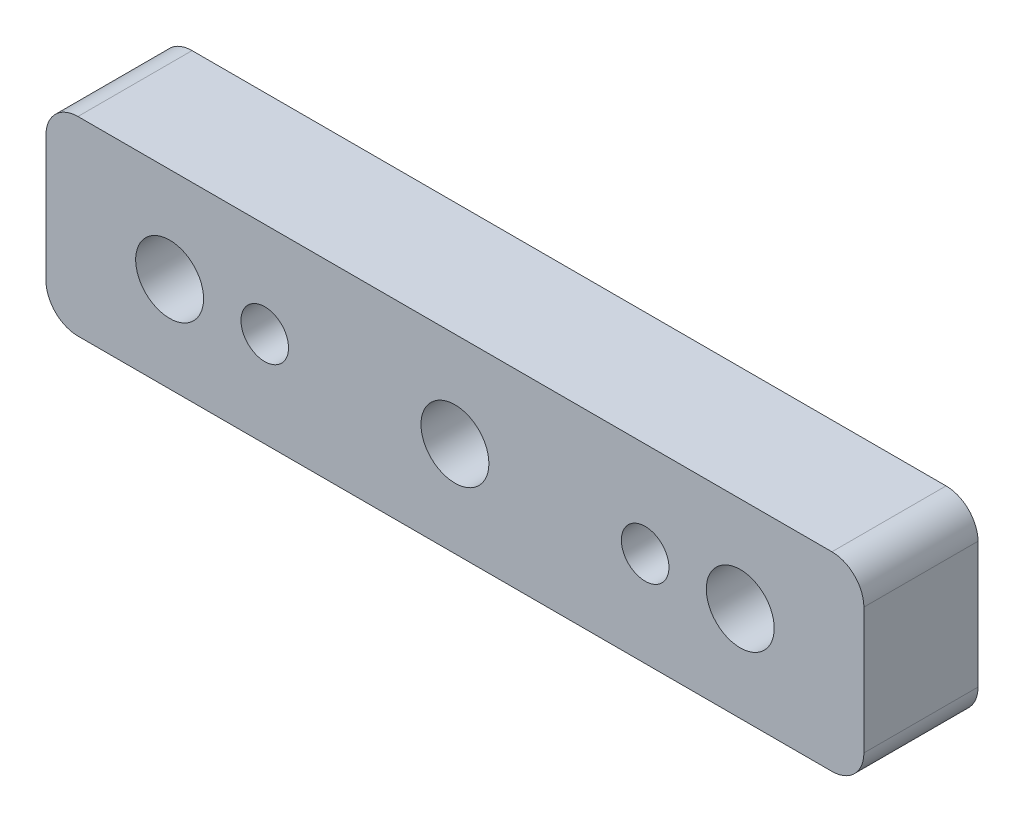
ISO-10303-21;
HEADER;
FILE_DESCRIPTION(('STEP AP214'),'2;1');
FILE_NAME('part.step','',(''),(''),'','','');
FILE_SCHEMA(('AUTOMOTIVE_DESIGN { 1 0 10303 214 1 1 1 1 }'));
ENDSEC;
DATA;
#1=APPLICATION_CONTEXT('core data for automotive mechanical design processes');
#2=APPLICATION_PROTOCOL_DEFINITION('international standard','automotive_design',2000,#1);
#3=PRODUCT_CONTEXT('',#1,'mechanical');
#4=PRODUCT('Part','Part','',(#3));
#5=PRODUCT_RELATED_PRODUCT_CATEGORY('part','',(#4));
#6=PRODUCT_DEFINITION_FORMATION('','',#4);
#7=PRODUCT_DEFINITION_CONTEXT('part definition',#1,'design');
#8=PRODUCT_DEFINITION('design','',#6,#7);
#9=PRODUCT_DEFINITION_SHAPE('','',#8);
#10=(LENGTH_UNIT() NAMED_UNIT(*) SI_UNIT(.MILLI.,.METRE.));
#11=(NAMED_UNIT(*) PLANE_ANGLE_UNIT() SI_UNIT($,.RADIAN.));
#12=(NAMED_UNIT(*) SI_UNIT($,.STERADIAN.) SOLID_ANGLE_UNIT());
#13=UNCERTAINTY_MEASURE_WITH_UNIT(LENGTH_MEASURE(1.E-05),#10,'distance_accuracy_value','');
#14=(GEOMETRIC_REPRESENTATION_CONTEXT(3) GLOBAL_UNCERTAINTY_ASSIGNED_CONTEXT((#13)) GLOBAL_UNIT_ASSIGNED_CONTEXT((#10,
#11,#12)) REPRESENTATION_CONTEXT('',''));
#15=CARTESIAN_POINT('',(0.,0.,0.));
#16=DIRECTION('',(0.,0.,1.));
#17=DIRECTION('',(1.,0.,0.));
#18=AXIS2_PLACEMENT_3D('',#15,#16,#17);
#19=CARTESIAN_POINT('',(39.64,6.64,6.));
#20=DIRECTION('',(0.,0.,-1.));
#21=DIRECTION('',(-1.,0.,0.));
#22=AXIS2_PLACEMENT_3D('',#19,#20,#21);
#23=PLANE('',#22);
#24=CARTESIAN_POINT('',(-20.,0.,6.));
#25=DIRECTION('',(0.,0.,1.));
#26=DIRECTION('',(1.,0.,0.));
#27=AXIS2_PLACEMENT_3D('',#24,#25,#26);
#28=CIRCLE('',#27,2.5);
#29=CARTESIAN_POINT('',(-17.5,0.,6.));
#30=VERTEX_POINT('',#29);
#31=EDGE_CURVE('E194',#30,#30,#28,.T.);
#32=ORIENTED_EDGE('',*,*,#31,.F.);
#33=EDGE_LOOP('',(#32));
#34=FACE_BOUND('',#33,.T.);
#35=CARTESIAN_POINT('',(0.,0.,6.));
#36=DIRECTION('',(0.,0.,1.));
#37=DIRECTION('',(1.,0.,0.));
#38=AXIS2_PLACEMENT_3D('',#35,#36,#37);
#39=CIRCLE('',#38,3.57);
#40=CARTESIAN_POINT('',(3.57,0.,6.));
#41=VERTEX_POINT('',#40);
#42=EDGE_CURVE('E182',#41,#41,#39,.T.);
#43=ORIENTED_EDGE('',*,*,#42,.F.);
#44=EDGE_LOOP('',(#43));
#45=FACE_BOUND('',#44,.T.);
#46=CARTESIAN_POINT('',(39.64,6.64,6.));
#47=DIRECTION('',(0.,0.,1.));
#48=DIRECTION('',(-1.,0.,0.));
#49=AXIS2_PLACEMENT_3D('',#46,#47,#48);
#50=CIRCLE('',#49,3.36);
#51=CARTESIAN_POINT('',(43.,6.63999999999998,6.));
#52=VERTEX_POINT('',#51);
#53=CARTESIAN_POINT('',(39.64,10.,6.));
#54=VERTEX_POINT('',#53);
#55=EDGE_CURVE('E145',#52,#54,#50,.T.);
#56=ORIENTED_EDGE('',*,*,#55,.T.);
#57=DIRECTION('',(-1.,0.,0.));
#58=VECTOR('',#57,1.);
#59=CARTESIAN_POINT('',(-39.64,10.,6.));
#60=LINE('',#59,#58);
#61=CARTESIAN_POINT('',(-39.64,10.,6.));
#62=VERTEX_POINT('',#61);
#63=EDGE_CURVE('E93',#54,#62,#60,.T.);
#64=ORIENTED_EDGE('',*,*,#63,.T.);
#65=CARTESIAN_POINT('',(-39.64,6.64,6.));
#66=DIRECTION('',(0.,0.,1.));
#67=DIRECTION('',(-1.,0.,0.));
#68=AXIS2_PLACEMENT_3D('',#65,#66,#67);
#69=CIRCLE('',#68,3.36);
#70=CARTESIAN_POINT('',(-43.,6.63999999999998,6.));
#71=VERTEX_POINT('',#70);
#72=EDGE_CURVE('E160',#62,#71,#69,.T.);
#73=ORIENTED_EDGE('',*,*,#72,.T.);
#74=DIRECTION('',(0.,-1.,0.));
#75=VECTOR('',#74,1.);
#76=CARTESIAN_POINT('',(-43.,-6.63999999999998,6.));
#77=LINE('',#76,#75);
#78=CARTESIAN_POINT('',(-43.,-6.63999999999998,6.));
#79=VERTEX_POINT('',#78);
#80=EDGE_CURVE('E173',#71,#79,#77,.T.);
#81=ORIENTED_EDGE('',*,*,#80,.T.);
#82=CARTESIAN_POINT('',(-39.64,-6.64,6.));
#83=DIRECTION('',(0.,0.,1.));
#84=DIRECTION('',(-1.,0.,0.));
#85=AXIS2_PLACEMENT_3D('',#82,#83,#84);
#86=CIRCLE('',#85,3.36);
#87=CARTESIAN_POINT('',(-39.64,-10.,6.));
#88=VERTEX_POINT('',#87);
#89=EDGE_CURVE('E112',#79,#88,#86,.T.);
#90=ORIENTED_EDGE('',*,*,#89,.T.);
#91=DIRECTION('',(1.,0.,0.));
#92=VECTOR('',#91,1.);
#93=CARTESIAN_POINT('',(-39.64,-10.,6.));
#94=LINE('',#93,#92);
#95=CARTESIAN_POINT('',(39.64,-10.,6.));
#96=VERTEX_POINT('',#95);
#97=EDGE_CURVE('E106',#88,#96,#94,.T.);
#98=ORIENTED_EDGE('',*,*,#97,.T.);
#99=CARTESIAN_POINT('',(39.64,-6.64,6.));
#100=DIRECTION('',(0.,0.,1.));
#101=DIRECTION('',(1.,0.,0.));
#102=AXIS2_PLACEMENT_3D('',#99,#100,#101);
#103=CIRCLE('',#102,3.36);
#104=CARTESIAN_POINT('',(43.,-6.63999999999998,6.));
#105=VERTEX_POINT('',#104);
#106=EDGE_CURVE('E110',#96,#105,#103,.T.);
#107=ORIENTED_EDGE('',*,*,#106,.T.);
#108=DIRECTION('',(0.,1.,0.));
#109=VECTOR('',#108,1.);
#110=CARTESIAN_POINT('',(43.,-6.63999999999998,6.));
#111=LINE('',#110,#109);
#112=EDGE_CURVE('E50',#105,#52,#111,.T.);
#113=ORIENTED_EDGE('',*,*,#112,.T.);
#114=EDGE_LOOP('',(#56,#64,#73,#81,#90,#98,#107,#113));
#115=FACE_BOUND('',#114,.T.);
#116=CARTESIAN_POINT('',(-30.,0.,6.));
#117=DIRECTION('',(0.,0.,1.));
#118=DIRECTION('',(1.,0.,0.));
#119=AXIS2_PLACEMENT_3D('',#116,#117,#118);
#120=CIRCLE('',#119,3.57);
#121=CARTESIAN_POINT('',(-26.43,0.,6.));
#122=VERTEX_POINT('',#121);
#123=EDGE_CURVE('E134',#122,#122,#120,.T.);
#124=ORIENTED_EDGE('',*,*,#123,.F.);
#125=EDGE_LOOP('',(#124));
#126=FACE_BOUND('',#125,.T.);
#127=CARTESIAN_POINT('',(30.,0.,6.));
#128=DIRECTION('',(0.,0.,1.));
#129=DIRECTION('',(1.,0.,0.));
#130=AXIS2_PLACEMENT_3D('',#127,#128,#129);
#131=CIRCLE('',#130,3.57);
#132=CARTESIAN_POINT('',(33.57,0.,6.));
#133=VERTEX_POINT('',#132);
#134=EDGE_CURVE('E188',#133,#133,#131,.T.);
#135=ORIENTED_EDGE('',*,*,#134,.F.);
#136=EDGE_LOOP('',(#135));
#137=FACE_BOUND('',#136,.T.);
#138=CARTESIAN_POINT('',(20.,0.,6.));
#139=DIRECTION('',(0.,0.,1.));
#140=DIRECTION('',(1.,0.,0.));
#141=AXIS2_PLACEMENT_3D('',#138,#139,#140);
#142=CIRCLE('',#141,2.5);
#143=CARTESIAN_POINT('',(22.5,0.,6.));
#144=VERTEX_POINT('',#143);
#145=EDGE_CURVE('E200',#144,#144,#142,.T.);
#146=ORIENTED_EDGE('',*,*,#145,.F.);
#147=EDGE_LOOP('',(#146));
#148=FACE_BOUND('',#147,.T.);
#149=ADVANCED_FACE('F33',(#34,#45,#115,#126,#137,#148),#23,.F.);
#150=CARTESIAN_POINT('',(39.64,6.64,-6.));
#151=DIRECTION('',(0.,0.,-1.));
#152=DIRECTION('',(-1.,0.,0.));
#153=AXIS2_PLACEMENT_3D('',#150,#151,#152);
#154=PLANE('',#153);
#155=CARTESIAN_POINT('',(-20.,0.,-6.));
#156=DIRECTION('',(0.,0.,1.));
#157=DIRECTION('',(1.,0.,0.));
#158=AXIS2_PLACEMENT_3D('',#155,#156,#157);
#159=CIRCLE('',#158,2.5);
#160=CARTESIAN_POINT('',(-17.5,0.,-6.));
#161=VERTEX_POINT('',#160);
#162=EDGE_CURVE('E197',#161,#161,#159,.T.);
#163=ORIENTED_EDGE('',*,*,#162,.T.);
#164=EDGE_LOOP('',(#163));
#165=FACE_BOUND('',#164,.T.);
#166=CARTESIAN_POINT('',(0.,0.,-6.));
#167=DIRECTION('',(0.,0.,1.));
#168=DIRECTION('',(1.,0.,0.));
#169=AXIS2_PLACEMENT_3D('',#166,#167,#168);
#170=CIRCLE('',#169,3.57);
#171=CARTESIAN_POINT('',(3.57,0.,-6.));
#172=VERTEX_POINT('',#171);
#173=EDGE_CURVE('E185',#172,#172,#170,.T.);
#174=ORIENTED_EDGE('',*,*,#173,.T.);
#175=EDGE_LOOP('',(#174));
#176=FACE_BOUND('',#175,.T.);
#177=CARTESIAN_POINT('',(39.64,6.64,-6.));
#178=DIRECTION('',(0.,0.,1.));
#179=DIRECTION('',(-1.,0.,0.));
#180=AXIS2_PLACEMENT_3D('',#177,#178,#179);
#181=CIRCLE('',#180,3.36);
#182=CARTESIAN_POINT('',(43.,6.63999999999998,-6.));
#183=VERTEX_POINT('',#182);
#184=CARTESIAN_POINT('',(39.64,10.,-6.));
#185=VERTEX_POINT('',#184);
#186=EDGE_CURVE('E130',#183,#185,#181,.T.);
#187=ORIENTED_EDGE('',*,*,#186,.F.);
#188=DIRECTION('',(0.,1.,0.));
#189=VECTOR('',#188,1.);
#190=CARTESIAN_POINT('',(43.,-6.63999999999998,-6.));
#191=LINE('',#190,#189);
#192=CARTESIAN_POINT('',(43.,-6.63999999999998,-6.));
#193=VERTEX_POINT('',#192);
#194=EDGE_CURVE('E85',#193,#183,#191,.T.);
#195=ORIENTED_EDGE('',*,*,#194,.F.);
#196=CARTESIAN_POINT('',(39.64,-6.64,-6.));
#197=DIRECTION('',(0.,0.,1.));
#198=DIRECTION('',(1.,0.,0.));
#199=AXIS2_PLACEMENT_3D('',#196,#197,#198);
#200=CIRCLE('',#199,3.36);
#201=CARTESIAN_POINT('',(39.64,-10.,-6.));
#202=VERTEX_POINT('',#201);
#203=EDGE_CURVE('E79',#202,#193,#200,.T.);
#204=ORIENTED_EDGE('',*,*,#203,.F.);
#205=DIRECTION('',(1.,0.,0.));
#206=VECTOR('',#205,1.);
#207=CARTESIAN_POINT('',(-39.64,-10.,-6.));
#208=LINE('',#207,#206);
#209=CARTESIAN_POINT('',(-39.64,-10.,-6.));
#210=VERTEX_POINT('',#209);
#211=EDGE_CURVE('E120',#210,#202,#208,.T.);
#212=ORIENTED_EDGE('',*,*,#211,.F.);
#213=CARTESIAN_POINT('',(-39.64,-6.64,-6.));
#214=DIRECTION('',(0.,0.,1.));
#215=DIRECTION('',(-1.,0.,0.));
#216=AXIS2_PLACEMENT_3D('',#213,#214,#215);
#217=CIRCLE('',#216,3.36);
#218=CARTESIAN_POINT('',(-43.,-6.63999999999998,-6.));
#219=VERTEX_POINT('',#218);
#220=EDGE_CURVE('E140',#219,#210,#217,.T.);
#221=ORIENTED_EDGE('',*,*,#220,.F.);
#222=DIRECTION('',(0.,-1.,0.));
#223=VECTOR('',#222,1.);
#224=CARTESIAN_POINT('',(-43.,-6.63999999999998,-6.));
#225=LINE('',#224,#223);
#226=CARTESIAN_POINT('',(-43.,6.63999999999998,-6.));
#227=VERTEX_POINT('',#226);
#228=EDGE_CURVE('E138',#227,#219,#225,.T.);
#229=ORIENTED_EDGE('',*,*,#228,.F.);
#230=CARTESIAN_POINT('',(-39.64,6.64,-6.));
#231=DIRECTION('',(0.,0.,1.));
#232=DIRECTION('',(-1.,0.,0.));
#233=AXIS2_PLACEMENT_3D('',#230,#231,#232);
#234=CIRCLE('',#233,3.36);
#235=CARTESIAN_POINT('',(-39.64,10.,-6.));
#236=VERTEX_POINT('',#235);
#237=EDGE_CURVE('E136',#236,#227,#234,.T.);
#238=ORIENTED_EDGE('',*,*,#237,.F.);
#239=DIRECTION('',(-1.,0.,0.));
#240=VECTOR('',#239,1.);
#241=CARTESIAN_POINT('',(-39.64,10.,-6.));
#242=LINE('',#241,#240);
#243=EDGE_CURVE('E133',#185,#236,#242,.T.);
#244=ORIENTED_EDGE('',*,*,#243,.F.);
#245=EDGE_LOOP('',(#187,#195,#204,#212,#221,#229,#238,#244));
#246=FACE_BOUND('',#245,.T.);
#247=CARTESIAN_POINT('',(-30.,0.,-6.));
#248=DIRECTION('',(0.,0.,1.));
#249=DIRECTION('',(1.,0.,0.));
#250=AXIS2_PLACEMENT_3D('',#247,#248,#249);
#251=CIRCLE('',#250,3.57);
#252=CARTESIAN_POINT('',(-26.43,0.,-6.));
#253=VERTEX_POINT('',#252);
#254=EDGE_CURVE('E179',#253,#253,#251,.T.);
#255=ORIENTED_EDGE('',*,*,#254,.T.);
#256=EDGE_LOOP('',(#255));
#257=FACE_BOUND('',#256,.T.);
#258=CARTESIAN_POINT('',(30.,0.,-6.));
#259=DIRECTION('',(0.,0.,1.));
#260=DIRECTION('',(1.,0.,0.));
#261=AXIS2_PLACEMENT_3D('',#258,#259,#260);
#262=CIRCLE('',#261,3.57);
#263=CARTESIAN_POINT('',(33.57,0.,-6.));
#264=VERTEX_POINT('',#263);
#265=EDGE_CURVE('E191',#264,#264,#262,.T.);
#266=ORIENTED_EDGE('',*,*,#265,.T.);
#267=EDGE_LOOP('',(#266));
#268=FACE_BOUND('',#267,.T.);
#269=CARTESIAN_POINT('',(20.,0.,-6.));
#270=DIRECTION('',(0.,0.,1.));
#271=DIRECTION('',(1.,0.,0.));
#272=AXIS2_PLACEMENT_3D('',#269,#270,#271);
#273=CIRCLE('',#272,2.5);
#274=CARTESIAN_POINT('',(22.5,0.,-6.));
#275=VERTEX_POINT('',#274);
#276=EDGE_CURVE('E203',#275,#275,#273,.T.);
#277=ORIENTED_EDGE('',*,*,#276,.T.);
#278=EDGE_LOOP('',(#277));
#279=FACE_BOUND('',#278,.T.);
#280=ADVANCED_FACE('F164',(#165,#176,#246,#257,#268,#279),#154,.T.);
#281=CARTESIAN_POINT('',(39.64,6.64,6.));
#282=DIRECTION('',(0.,0.,-1.));
#283=DIRECTION('',(-1.,0.,0.));
#284=AXIS2_PLACEMENT_3D('',#281,#282,#283);
#285=CYLINDRICAL_SURFACE('',#284,3.36);
#286=ORIENTED_EDGE('',*,*,#186,.T.);
#287=DIRECTION('',(0.,0.,-1.));
#288=VECTOR('',#287,1.);
#289=CARTESIAN_POINT('',(39.64,10.,6.));
#290=LINE('',#289,#288);
#291=EDGE_CURVE('E11',#54,#185,#290,.T.);
#292=ORIENTED_EDGE('',*,*,#291,.F.);
#293=ORIENTED_EDGE('',*,*,#55,.F.);
#294=DIRECTION('',(0.,0.,-1.));
#295=VECTOR('',#294,1.);
#296=CARTESIAN_POINT('',(43.,6.63999999999998,6.));
#297=LINE('',#296,#295);
#298=EDGE_CURVE('E126',#52,#183,#297,.T.);
#299=ORIENTED_EDGE('',*,*,#298,.T.);
#300=EDGE_LOOP('',(#286,#292,#293,#299));
#301=FACE_BOUND('',#300,.T.);
#302=ADVANCED_FACE('F35',(#301),#285,.T.);
#303=CARTESIAN_POINT('',(-39.64,10.,6.));
#304=DIRECTION('',(0.,-1.,0.));
#305=DIRECTION('',(0.,0.,-1.));
#306=AXIS2_PLACEMENT_3D('',#303,#304,#305);
#307=PLANE('',#306);
#308=ORIENTED_EDGE('',*,*,#243,.T.);
#309=DIRECTION('',(0.,0.,-1.));
#310=VECTOR('',#309,1.);
#311=CARTESIAN_POINT('',(-39.64,10.,6.));
#312=LINE('',#311,#310);
#313=EDGE_CURVE('E42',#62,#236,#312,.T.);
#314=ORIENTED_EDGE('',*,*,#313,.F.);
#315=ORIENTED_EDGE('',*,*,#63,.F.);
#316=ORIENTED_EDGE('',*,*,#291,.T.);
#317=EDGE_LOOP('',(#308,#314,#315,#316));
#318=FACE_BOUND('',#317,.T.);
#319=ADVANCED_FACE('F238',(#318),#307,.F.);
#320=CARTESIAN_POINT('',(-39.64,6.64,6.));
#321=DIRECTION('',(0.,0.,-1.));
#322=DIRECTION('',(-1.,0.,0.));
#323=AXIS2_PLACEMENT_3D('',#320,#321,#322);
#324=CYLINDRICAL_SURFACE('',#323,3.36);
#325=ORIENTED_EDGE('',*,*,#237,.T.);
#326=DIRECTION('',(0.,0.,-1.));
#327=VECTOR('',#326,1.);
#328=CARTESIAN_POINT('',(-43.,6.63999999999998,6.));
#329=LINE('',#328,#327);
#330=EDGE_CURVE('E152',#71,#227,#329,.T.);
#331=ORIENTED_EDGE('',*,*,#330,.F.);
#332=ORIENTED_EDGE('',*,*,#72,.F.);
#333=ORIENTED_EDGE('',*,*,#313,.T.);
#334=EDGE_LOOP('',(#325,#331,#332,#333));
#335=FACE_BOUND('',#334,.T.);
#336=ADVANCED_FACE('F158',(#335),#324,.T.);
#337=CARTESIAN_POINT('',(-43.,-6.63999999999998,6.));
#338=DIRECTION('',(1.,0.,0.));
#339=DIRECTION('',(0.,0.,-1.));
#340=AXIS2_PLACEMENT_3D('',#337,#338,#339);
#341=PLANE('',#340);
#342=ORIENTED_EDGE('',*,*,#228,.T.);
#343=DIRECTION('',(0.,0.,-1.));
#344=VECTOR('',#343,1.);
#345=CARTESIAN_POINT('',(-43.,-6.63999999999998,6.));
#346=LINE('',#345,#344);
#347=EDGE_CURVE('E149',#79,#219,#346,.T.);
#348=ORIENTED_EDGE('',*,*,#347,.F.);
#349=ORIENTED_EDGE('',*,*,#80,.F.);
#350=ORIENTED_EDGE('',*,*,#330,.T.);
#351=EDGE_LOOP('',(#342,#348,#349,#350));
#352=FACE_BOUND('',#351,.T.);
#353=ADVANCED_FACE('F169',(#352),#341,.F.);
#354=CARTESIAN_POINT('',(-39.64,-6.64,6.));
#355=DIRECTION('',(0.,0.,-1.));
#356=DIRECTION('',(-1.,0.,0.));
#357=AXIS2_PLACEMENT_3D('',#354,#355,#356);
#358=CYLINDRICAL_SURFACE('',#357,3.36);
#359=ORIENTED_EDGE('',*,*,#220,.T.);
#360=DIRECTION('',(0.,0.,-1.));
#361=VECTOR('',#360,1.);
#362=CARTESIAN_POINT('',(-39.64,-10.,6.));
#363=LINE('',#362,#361);
#364=EDGE_CURVE('E121',#88,#210,#363,.T.);
#365=ORIENTED_EDGE('',*,*,#364,.F.);
#366=ORIENTED_EDGE('',*,*,#89,.F.);
#367=ORIENTED_EDGE('',*,*,#347,.T.);
#368=EDGE_LOOP('',(#359,#365,#366,#367));
#369=FACE_BOUND('',#368,.T.);
#370=ADVANCED_FACE('F172',(#369),#358,.T.);
#371=CARTESIAN_POINT('',(-39.64,-10.,6.));
#372=DIRECTION('',(0.,1.,0.));
#373=DIRECTION('',(0.,0.,1.));
#374=AXIS2_PLACEMENT_3D('',#371,#372,#373);
#375=PLANE('',#374);
#376=ORIENTED_EDGE('',*,*,#211,.T.);
#377=DIRECTION('',(0.,0.,-1.));
#378=VECTOR('',#377,1.);
#379=CARTESIAN_POINT('',(39.64,-10.,6.));
#380=LINE('',#379,#378);
#381=EDGE_CURVE('E117',#96,#202,#380,.T.);
#382=ORIENTED_EDGE('',*,*,#381,.F.);
#383=ORIENTED_EDGE('',*,*,#97,.F.);
#384=ORIENTED_EDGE('',*,*,#364,.T.);
#385=EDGE_LOOP('',(#376,#382,#383,#384));
#386=FACE_BOUND('',#385,.T.);
#387=ADVANCED_FACE('F118',(#386),#375,.F.);
#388=CARTESIAN_POINT('',(39.64,-6.64,6.));
#389=DIRECTION('',(0.,0.,-1.));
#390=DIRECTION('',(-1.,0.,0.));
#391=AXIS2_PLACEMENT_3D('',#388,#389,#390);
#392=CYLINDRICAL_SURFACE('',#391,3.36);
#393=ORIENTED_EDGE('',*,*,#203,.T.);
#394=DIRECTION('',(0.,0.,-1.));
#395=VECTOR('',#394,1.);
#396=CARTESIAN_POINT('',(43.,-6.63999999999998,6.));
#397=LINE('',#396,#395);
#398=EDGE_CURVE('E122',#105,#193,#397,.T.);
#399=ORIENTED_EDGE('',*,*,#398,.F.);
#400=ORIENTED_EDGE('',*,*,#106,.F.);
#401=ORIENTED_EDGE('',*,*,#381,.T.);
#402=EDGE_LOOP('',(#393,#399,#400,#401));
#403=FACE_BOUND('',#402,.T.);
#404=ADVANCED_FACE('F124',(#403),#392,.T.);
#405=CARTESIAN_POINT('',(43.,-6.63999999999998,6.));
#406=DIRECTION('',(-1.,0.,0.));
#407=DIRECTION('',(0.,0.,1.));
#408=AXIS2_PLACEMENT_3D('',#405,#406,#407);
#409=PLANE('',#408);
#410=ORIENTED_EDGE('',*,*,#194,.T.);
#411=ORIENTED_EDGE('',*,*,#298,.F.);
#412=ORIENTED_EDGE('',*,*,#112,.F.);
#413=ORIENTED_EDGE('',*,*,#398,.T.);
#414=EDGE_LOOP('',(#410,#411,#412,#413));
#415=FACE_BOUND('',#414,.T.);
#416=ADVANCED_FACE('F226',(#415),#409,.F.);
#417=CARTESIAN_POINT('',(-30.,0.,6.));
#418=DIRECTION('',(0.,0.,-1.));
#419=DIRECTION('',(-1.,0.,0.));
#420=AXIS2_PLACEMENT_3D('',#417,#418,#419);
#421=CYLINDRICAL_SURFACE('',#420,3.57);
#422=ORIENTED_EDGE('',*,*,#123,.T.);
#423=EDGE_LOOP('',(#422));
#424=FACE_BOUND('',#423,.T.);
#425=ORIENTED_EDGE('',*,*,#254,.F.);
#426=EDGE_LOOP('',(#425));
#427=FACE_BOUND('',#426,.T.);
#428=ADVANCED_FACE('F223',(#424,#427),#421,.F.);
#429=CARTESIAN_POINT('',(0.,0.,6.));
#430=DIRECTION('',(0.,0.,-1.));
#431=DIRECTION('',(-1.,0.,0.));
#432=AXIS2_PLACEMENT_3D('',#429,#430,#431);
#433=CYLINDRICAL_SURFACE('',#432,3.57);
#434=ORIENTED_EDGE('',*,*,#42,.T.);
#435=EDGE_LOOP('',(#434));
#436=FACE_BOUND('',#435,.T.);
#437=ORIENTED_EDGE('',*,*,#173,.F.);
#438=EDGE_LOOP('',(#437));
#439=FACE_BOUND('',#438,.T.);
#440=ADVANCED_FACE('F302',(#436,#439),#433,.F.);
#441=CARTESIAN_POINT('',(30.,0.,6.));
#442=DIRECTION('',(0.,0.,-1.));
#443=DIRECTION('',(-1.,0.,0.));
#444=AXIS2_PLACEMENT_3D('',#441,#442,#443);
#445=CYLINDRICAL_SURFACE('',#444,3.57);
#446=ORIENTED_EDGE('',*,*,#134,.T.);
#447=EDGE_LOOP('',(#446));
#448=FACE_BOUND('',#447,.T.);
#449=ORIENTED_EDGE('',*,*,#265,.F.);
#450=EDGE_LOOP('',(#449));
#451=FACE_BOUND('',#450,.T.);
#452=ADVANCED_FACE('F310',(#448,#451),#445,.F.);
#453=CARTESIAN_POINT('',(-20.,0.,6.));
#454=DIRECTION('',(0.,0.,-1.));
#455=DIRECTION('',(-1.,0.,0.));
#456=AXIS2_PLACEMENT_3D('',#453,#454,#455);
#457=CYLINDRICAL_SURFACE('',#456,2.5);
#458=ORIENTED_EDGE('',*,*,#31,.T.);
#459=EDGE_LOOP('',(#458));
#460=FACE_BOUND('',#459,.T.);
#461=ORIENTED_EDGE('',*,*,#162,.F.);
#462=EDGE_LOOP('',(#461));
#463=FACE_BOUND('',#462,.T.);
#464=ADVANCED_FACE('F318',(#460,#463),#457,.F.);
#465=CARTESIAN_POINT('',(20.,0.,6.));
#466=DIRECTION('',(0.,0.,-1.));
#467=DIRECTION('',(-1.,0.,0.));
#468=AXIS2_PLACEMENT_3D('',#465,#466,#467);
#469=CYLINDRICAL_SURFACE('',#468,2.5);
#470=ORIENTED_EDGE('',*,*,#145,.T.);
#471=EDGE_LOOP('',(#470));
#472=FACE_BOUND('',#471,.T.);
#473=ORIENTED_EDGE('',*,*,#276,.F.);
#474=EDGE_LOOP('',(#473));
#475=FACE_BOUND('',#474,.T.);
#476=ADVANCED_FACE('F209',(#472,#475),#469,.F.);
#477=CLOSED_SHELL('',(#149,#280,#302,#319,#336,#353,#370,#387,#404,#416,#428,#440,#452,#464,#476));
#478=MANIFOLD_SOLID_BREP('B2',#477);
#479=ADVANCED_BREP_SHAPE_REPRESENTATION('',(#18,#478),#14);
#480=SHAPE_DEFINITION_REPRESENTATION(#9,#479);
ENDSEC;
END-ISO-10303-21;
